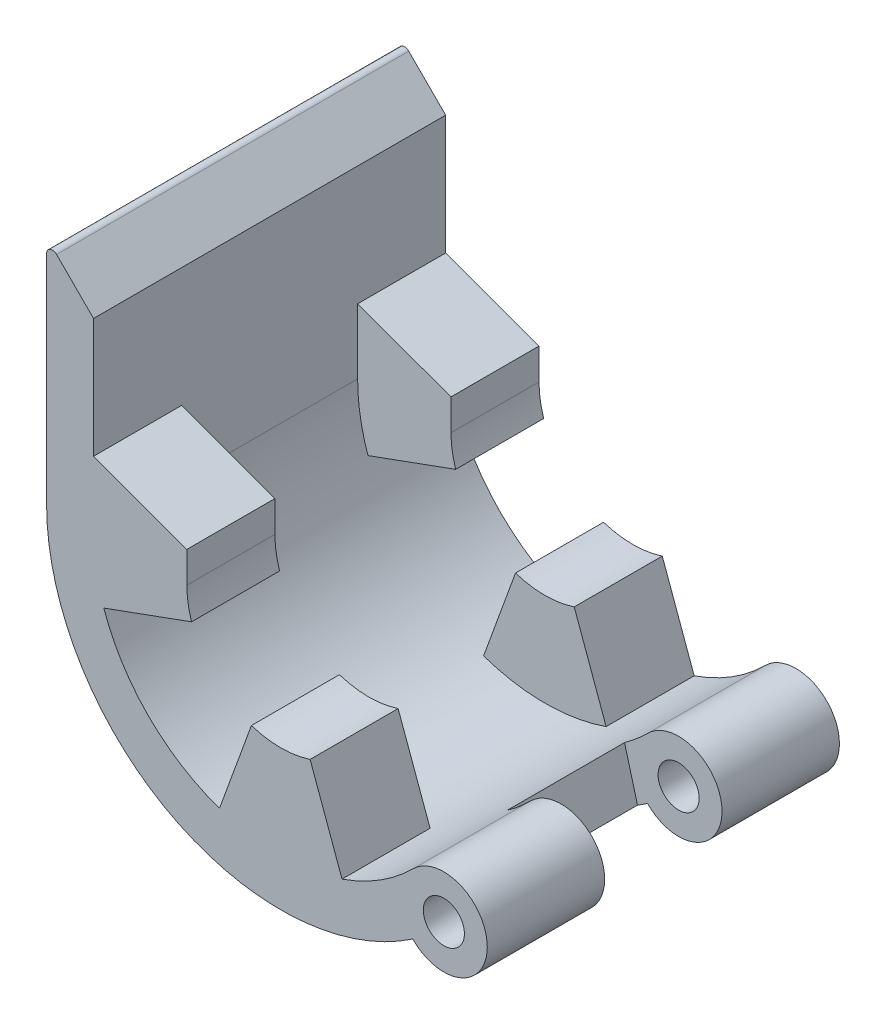
ISO-10303-21;
HEADER;
FILE_DESCRIPTION(('STEP AP214'),'2;1');
FILE_NAME('part.step','',(''),(''),'','','');
FILE_SCHEMA(('AUTOMOTIVE_DESIGN { 1 0 10303 214 1 1 1 1 }'));
ENDSEC;
DATA;
#1=APPLICATION_CONTEXT('core data for automotive mechanical design processes');
#2=APPLICATION_PROTOCOL_DEFINITION('international standard','automotive_design',2000,#1);
#3=PRODUCT_CONTEXT('',#1,'mechanical');
#4=PRODUCT('Part','Part','',(#3));
#5=PRODUCT_RELATED_PRODUCT_CATEGORY('part','',(#4));
#6=PRODUCT_DEFINITION_FORMATION('','',#4);
#7=PRODUCT_DEFINITION_CONTEXT('part definition',#1,'design');
#8=PRODUCT_DEFINITION('design','',#6,#7);
#9=PRODUCT_DEFINITION_SHAPE('','',#8);
#10=(LENGTH_UNIT() NAMED_UNIT(*) SI_UNIT(.MILLI.,.METRE.));
#11=(NAMED_UNIT(*) PLANE_ANGLE_UNIT() SI_UNIT($,.RADIAN.));
#12=(NAMED_UNIT(*) SI_UNIT($,.STERADIAN.) SOLID_ANGLE_UNIT());
#13=UNCERTAINTY_MEASURE_WITH_UNIT(LENGTH_MEASURE(1.E-05),#10,'distance_accuracy_value','');
#14=(GEOMETRIC_REPRESENTATION_CONTEXT(3) GLOBAL_UNCERTAINTY_ASSIGNED_CONTEXT((#13)) GLOBAL_UNIT_ASSIGNED_CONTEXT((#10,
#11,#12)) REPRESENTATION_CONTEXT('',''));
#15=CARTESIAN_POINT('',(0.,0.,0.));
#16=DIRECTION('',(0.,0.,1.));
#17=DIRECTION('',(1.,0.,0.));
#18=AXIS2_PLACEMENT_3D('',#15,#16,#17);
#19=CARTESIAN_POINT('',(0.,0.,15.));
#20=DIRECTION('',(0.,0.,-1.));
#21=DIRECTION('',(-1.,0.,0.));
#22=AXIS2_PLACEMENT_3D('',#19,#20,#21);
#23=CYLINDRICAL_SURFACE('',#22,15.95);
#24=DIRECTION('',(0.,0.,1.));
#25=VECTOR('',#24,1.);
#26=CARTESIAN_POINT('',(9.28940396087531,-12.9657037622982,-5.));
#27=LINE('',#26,#25);
#28=CARTESIAN_POINT('',(9.28940396087531,-12.9657037622982,-5.));
#29=VERTEX_POINT('',#28);
#30=CARTESIAN_POINT('',(9.28940396087531,-12.9657037622982,5.));
#31=VERTEX_POINT('',#30);
#32=EDGE_CURVE('E252',#29,#31,#27,.T.);
#33=ORIENTED_EDGE('',*,*,#32,.F.);
#34=CARTESIAN_POINT('',(0.,0.,-5.));
#35=DIRECTION('',(0.,0.,1.));
#36=DIRECTION('',(1.,0.,0.));
#37=AXIS2_PLACEMENT_3D('',#34,#35,#36);
#38=CIRCLE('',#37,15.95);
#39=CARTESIAN_POINT('',(11.2783531599254,-11.2783531599255,-5.));
#40=VERTEX_POINT('',#39);
#41=EDGE_CURVE('E235',#29,#40,#38,.T.);
#42=ORIENTED_EDGE('',*,*,#41,.T.);
#43=DIRECTION('',(0.,0.,-1.));
#44=VECTOR('',#43,1.);
#45=CARTESIAN_POINT('',(11.2783531599254,-11.2783531599255,15.));
#46=LINE('',#45,#44);
#47=CARTESIAN_POINT('',(11.2783531599254,-11.2783531599255,-15.));
#48=VERTEX_POINT('',#47);
#49=EDGE_CURVE('E475',#40,#48,#46,.T.);
#50=ORIENTED_EDGE('',*,*,#49,.T.);
#51=CARTESIAN_POINT('',(0.,0.,-15.));
#52=DIRECTION('',(0.,0.,1.));
#53=DIRECTION('',(1.,0.,0.));
#54=AXIS2_PLACEMENT_3D('',#51,#52,#53);
#55=CIRCLE('',#54,15.95);
#56=CARTESIAN_POINT('',(5.21972578697734,-15.0717272636139,-15.));
#57=VERTEX_POINT('',#56);
#58=EDGE_CURVE('E433',#57,#48,#55,.T.);
#59=ORIENTED_EDGE('',*,*,#58,.F.);
#60=DIRECTION('',(0.,0.,-1.));
#61=VECTOR('',#60,1.);
#62=CARTESIAN_POINT('',(5.21972578697734,-15.0717272636139,-7.5));
#63=LINE('',#62,#61);
#64=CARTESIAN_POINT('',(5.21972578697734,-15.0717272636139,-7.5));
#65=VERTEX_POINT('',#64);
#66=EDGE_CURVE('E299',#65,#57,#63,.T.);
#67=ORIENTED_EDGE('',*,*,#66,.F.);
#68=CARTESIAN_POINT('',(0.,0.,-7.5));
#69=DIRECTION('',(0.,0.,1.));
#70=DIRECTION('',(1.,0.,0.));
#71=AXIS2_PLACEMENT_3D('',#68,#69,#70);
#72=CIRCLE('',#71,15.95);
#73=CARTESIAN_POINT('',(-5.21972578697734,-15.0717272636139,-7.5));
#74=VERTEX_POINT('',#73);
#75=EDGE_CURVE('E278',#74,#65,#72,.T.);
#76=ORIENTED_EDGE('',*,*,#75,.F.);
#77=DIRECTION('',(0.,0.,-1.));
#78=VECTOR('',#77,1.);
#79=CARTESIAN_POINT('',(-5.21972578697734,-15.0717272636139,-7.5));
#80=LINE('',#79,#78);
#81=CARTESIAN_POINT('',(-5.21972578697734,-15.0717272636139,-15.));
#82=VERTEX_POINT('',#81);
#83=EDGE_CURVE('E295',#74,#82,#80,.T.);
#84=ORIENTED_EDGE('',*,*,#83,.T.);
#85=CARTESIAN_POINT('',(-15.071727263614,-5.21972578697729,-15.));
#86=VERTEX_POINT('',#85);
#87=EDGE_CURVE('E476',#86,#82,#55,.T.);
#88=ORIENTED_EDGE('',*,*,#87,.F.);
#89=DIRECTION('',(0.,0.,-1.));
#90=VECTOR('',#89,1.);
#91=CARTESIAN_POINT('',(-15.071727263614,-5.21972578697728,-7.5));
#92=LINE('',#91,#90);
#93=CARTESIAN_POINT('',(-15.071727263614,-5.21972578697728,-7.5));
#94=VERTEX_POINT('',#93);
#95=EDGE_CURVE('E349',#94,#86,#92,.T.);
#96=ORIENTED_EDGE('',*,*,#95,.F.);
#97=CARTESIAN_POINT('',(0.,0.,-7.5));
#98=DIRECTION('',(0.,0.,1.));
#99=DIRECTION('',(1.,0.,0.));
#100=AXIS2_PLACEMENT_3D('',#97,#98,#99);
#101=CIRCLE('',#100,15.95);
#102=CARTESIAN_POINT('',(-15.95,0.,-7.5));
#103=VERTEX_POINT('',#102);
#104=EDGE_CURVE('E313',#103,#94,#101,.T.);
#105=ORIENTED_EDGE('',*,*,#104,.F.);
#106=DIRECTION('',(0.,0.,-1.));
#107=VECTOR('',#106,1.);
#108=CARTESIAN_POINT('',(-15.95,0.,15.));
#109=LINE('',#108,#107);
#110=CARTESIAN_POINT('',(-15.95,0.,7.5));
#111=VERTEX_POINT('',#110);
#112=EDGE_CURVE('E11',#111,#103,#109,.T.);
#113=ORIENTED_EDGE('',*,*,#112,.F.);
#114=CARTESIAN_POINT('',(0.,0.,7.5));
#115=DIRECTION('',(0.,0.,1.));
#116=DIRECTION('',(1.,0.,0.));
#117=AXIS2_PLACEMENT_3D('',#114,#115,#116);
#118=CIRCLE('',#117,15.95);
#119=CARTESIAN_POINT('',(-15.071727263614,-5.21972578697729,7.5));
#120=VERTEX_POINT('',#119);
#121=EDGE_CURVE('E414',#111,#120,#118,.T.);
#122=ORIENTED_EDGE('',*,*,#121,.T.);
#123=DIRECTION('',(0.,0.,1.));
#124=VECTOR('',#123,1.);
#125=CARTESIAN_POINT('',(-15.071727263614,-5.21972578697728,7.5));
#126=LINE('',#125,#124);
#127=CARTESIAN_POINT('',(-15.071727263614,-5.21972578697728,15.));
#128=VERTEX_POINT('',#127);
#129=EDGE_CURVE('E430',#120,#128,#126,.T.);
#130=ORIENTED_EDGE('',*,*,#129,.T.);
#131=CARTESIAN_POINT('',(0.,0.,15.));
#132=DIRECTION('',(0.,0.,1.));
#133=DIRECTION('',(1.,0.,0.));
#134=AXIS2_PLACEMENT_3D('',#131,#132,#133);
#135=CIRCLE('',#134,15.95);
#136=CARTESIAN_POINT('',(-5.21972578697734,-15.0717272636139,15.));
#137=VERTEX_POINT('',#136);
#138=EDGE_CURVE('E448',#128,#137,#135,.T.);
#139=ORIENTED_EDGE('',*,*,#138,.T.);
#140=DIRECTION('',(0.,0.,1.));
#141=VECTOR('',#140,1.);
#142=CARTESIAN_POINT('',(-5.21972578697734,-15.0717272636139,7.5));
#143=LINE('',#142,#141);
#144=CARTESIAN_POINT('',(-5.21972578697734,-15.0717272636139,7.5));
#145=VERTEX_POINT('',#144);
#146=EDGE_CURVE('E383',#145,#137,#143,.T.);
#147=ORIENTED_EDGE('',*,*,#146,.F.);
#148=CARTESIAN_POINT('',(0.,0.,7.5));
#149=DIRECTION('',(0.,0.,1.));
#150=DIRECTION('',(1.,0.,0.));
#151=AXIS2_PLACEMENT_3D('',#148,#149,#150);
#152=CIRCLE('',#151,15.95);
#153=CARTESIAN_POINT('',(5.21972578697734,-15.0717272636139,7.5));
#154=VERTEX_POINT('',#153);
#155=EDGE_CURVE('E364',#145,#154,#152,.T.);
#156=ORIENTED_EDGE('',*,*,#155,.T.);
#157=DIRECTION('',(0.,0.,1.));
#158=VECTOR('',#157,1.);
#159=CARTESIAN_POINT('',(5.21972578697734,-15.0717272636139,7.5));
#160=LINE('',#159,#158);
#161=CARTESIAN_POINT('',(5.21972578697734,-15.0717272636139,15.));
#162=VERTEX_POINT('',#161);
#163=EDGE_CURVE('E387',#154,#162,#160,.T.);
#164=ORIENTED_EDGE('',*,*,#163,.T.);
#165=CARTESIAN_POINT('',(11.2783531599254,-11.2783531599255,15.));
#166=VERTEX_POINT('',#165);
#167=EDGE_CURVE('E452',#162,#166,#135,.T.);
#168=ORIENTED_EDGE('',*,*,#167,.T.);
#169=CARTESIAN_POINT('',(11.2783531599254,-11.2783531599255,5.));
#170=VERTEX_POINT('',#169);
#171=EDGE_CURVE('E505',#166,#170,#46,.T.);
#172=ORIENTED_EDGE('',*,*,#171,.T.);
#173=CARTESIAN_POINT('',(0.,0.,5.));
#174=DIRECTION('',(0.,0.,1.));
#175=DIRECTION('',(1.,0.,0.));
#176=AXIS2_PLACEMENT_3D('',#173,#174,#175);
#177=CIRCLE('',#176,15.95);
#178=EDGE_CURVE('E56',#31,#170,#177,.T.);
#179=ORIENTED_EDGE('',*,*,#178,.F.);
#180=EDGE_LOOP('',(#33,#42,#50,#59,#67,#76,#84,#88,#96,#105,#113,#122,#130,#139,#147,#156,#164,
#168,#172,#179));
#181=FACE_BOUND('',#180,.T.);
#182=ADVANCED_FACE('F41',(#181),#23,.F.);
#183=CARTESIAN_POINT('',(0.,0.,15.));
#184=DIRECTION('',(0.,0.,-1.));
#185=DIRECTION('',(-1.,0.,0.));
#186=AXIS2_PLACEMENT_3D('',#183,#184,#185);
#187=CYLINDRICAL_SURFACE('',#186,19.95);
#188=CARTESIAN_POINT('',(0.,0.,-5.));
#189=DIRECTION('',(0.,0.,1.));
#190=DIRECTION('',(1.,0.,0.));
#191=AXIS2_PLACEMENT_3D('',#188,#189,#190);
#192=CIRCLE('',#191,19.95);
#193=CARTESIAN_POINT('',(10.3943586708893,-17.0282062420242,-5.));
#194=VERTEX_POINT('',#193);
#195=CARTESIAN_POINT('',(11.2459893589939,-16.4781741505967,-5.));
#196=VERTEX_POINT('',#195);
#197=EDGE_CURVE('E256',#194,#196,#192,.T.);
#198=ORIENTED_EDGE('',*,*,#197,.F.);
#199=DIRECTION('',(0.,0.,1.));
#200=VECTOR('',#199,1.);
#201=CARTESIAN_POINT('',(10.3943586708893,-17.0282062420242,-5.));
#202=LINE('',#201,#200);
#203=CARTESIAN_POINT('',(10.3943586708893,-17.0282062420242,5.));
#204=VERTEX_POINT('',#203);
#205=EDGE_CURVE('E254',#194,#204,#202,.T.);
#206=ORIENTED_EDGE('',*,*,#205,.T.);
#207=CARTESIAN_POINT('',(0.,0.,5.));
#208=DIRECTION('',(0.,0.,1.));
#209=DIRECTION('',(1.,0.,0.));
#210=AXIS2_PLACEMENT_3D('',#207,#208,#209);
#211=CIRCLE('',#210,19.95);
#212=CARTESIAN_POINT('',(11.2459893589939,-16.4781741505967,5.));
#213=VERTEX_POINT('',#212);
#214=EDGE_CURVE('E671',#204,#213,#211,.T.);
#215=ORIENTED_EDGE('',*,*,#214,.T.);
#216=DIRECTION('',(0.,0.,-1.));
#217=VECTOR('',#216,1.);
#218=CARTESIAN_POINT('',(11.2459893589939,-16.4781741505967,15.));
#219=LINE('',#218,#217);
#220=CARTESIAN_POINT('',(11.2459893589939,-16.4781741505967,15.));
#221=VERTEX_POINT('',#220);
#222=EDGE_CURVE('E509',#221,#213,#219,.T.);
#223=ORIENTED_EDGE('',*,*,#222,.F.);
#224=CARTESIAN_POINT('',(0.,0.,15.));
#225=DIRECTION('',(0.,0.,1.));
#226=DIRECTION('',(1.,0.,0.));
#227=AXIS2_PLACEMENT_3D('',#224,#225,#226);
#228=CIRCLE('',#227,19.95);
#229=CARTESIAN_POINT('',(-19.95,0.,15.));
#230=VERTEX_POINT('',#229);
#231=EDGE_CURVE('E464',#230,#221,#228,.T.);
#232=ORIENTED_EDGE('',*,*,#231,.F.);
#233=DIRECTION('',(0.,0.,-1.));
#234=VECTOR('',#233,1.);
#235=CARTESIAN_POINT('',(-19.95,0.,15.));
#236=LINE('',#235,#234);
#237=CARTESIAN_POINT('',(-19.95,0.,-15.));
#238=VERTEX_POINT('',#237);
#239=EDGE_CURVE('E513',#230,#238,#236,.T.);
#240=ORIENTED_EDGE('',*,*,#239,.T.);
#241=CARTESIAN_POINT('',(0.,0.,-15.));
#242=DIRECTION('',(0.,0.,1.));
#243=DIRECTION('',(1.,0.,0.));
#244=AXIS2_PLACEMENT_3D('',#241,#242,#243);
#245=CIRCLE('',#244,19.95);
#246=CARTESIAN_POINT('',(11.2459893589939,-16.4781741505967,-15.));
#247=VERTEX_POINT('',#246);
#248=EDGE_CURVE('E493',#238,#247,#245,.T.);
#249=ORIENTED_EDGE('',*,*,#248,.T.);
#250=EDGE_CURVE('E508',#196,#247,#219,.T.);
#251=ORIENTED_EDGE('',*,*,#250,.F.);
#252=EDGE_LOOP('',(#198,#206,#215,#223,#232,#240,#249,#251));
#253=FACE_BOUND('',#252,.T.);
#254=ADVANCED_FACE('F585',(#253),#187,.T.);
#255=CARTESIAN_POINT('',(13.8946482503156,-13.8946482503157,15.));
#256=DIRECTION('',(0.,0.,-1.));
#257=DIRECTION('',(-1.,0.,0.));
#258=AXIS2_PLACEMENT_3D('',#255,#256,#257);
#259=CYLINDRICAL_SURFACE('',#258,3.7);
#260=CARTESIAN_POINT('',(13.8946482503156,-13.8946482503157,-5.));
#261=DIRECTION('',(0.,0.,1.));
#262=DIRECTION('',(1.,0.,0.));
#263=AXIS2_PLACEMENT_3D('',#260,#261,#262);
#264=CIRCLE('',#263,3.7);
#265=EDGE_CURVE('E242',#196,#40,#264,.T.);
#266=ORIENTED_EDGE('',*,*,#265,.F.);
#267=ORIENTED_EDGE('',*,*,#250,.T.);
#268=CARTESIAN_POINT('',(13.8946482503156,-13.8946482503157,-15.));
#269=DIRECTION('',(0.,0.,1.));
#270=DIRECTION('',(1.,0.,0.));
#271=AXIS2_PLACEMENT_3D('',#268,#269,#270);
#272=CIRCLE('',#271,3.7);
#273=EDGE_CURVE('E497',#247,#48,#272,.T.);
#274=ORIENTED_EDGE('',*,*,#273,.T.);
#275=ORIENTED_EDGE('',*,*,#49,.F.);
#276=EDGE_LOOP('',(#266,#267,#274,#275));
#277=FACE_BOUND('',#276,.T.);
#278=ADVANCED_FACE('F582',(#277),#259,.T.);
#279=CARTESIAN_POINT('',(13.8946482503156,-13.8946482503157,15.));
#280=DIRECTION('',(0.,0.,-1.));
#281=DIRECTION('',(-1.,0.,0.));
#282=AXIS2_PLACEMENT_3D('',#279,#280,#281);
#283=CYLINDRICAL_SURFACE('',#282,1.75);
#284=CARTESIAN_POINT('',(13.8946482503156,-13.8946482503157,-15.));
#285=DIRECTION('',(0.,0.,1.));
#286=DIRECTION('',(1.,0.,0.));
#287=AXIS2_PLACEMENT_3D('',#284,#285,#286);
#288=CIRCLE('',#287,1.75);
#289=CARTESIAN_POINT('',(15.6446482503156,-13.8946482503157,-15.));
#290=VERTEX_POINT('',#289);
#291=EDGE_CURVE('E501',#290,#290,#288,.T.);
#292=ORIENTED_EDGE('',*,*,#291,.F.);
#293=EDGE_LOOP('',(#292));
#294=FACE_BOUND('',#293,.T.);
#295=CARTESIAN_POINT('',(13.8946482503156,-13.8946482503157,-5.));
#296=DIRECTION('',(0.,0.,1.));
#297=DIRECTION('',(1.,0.,0.));
#298=AXIS2_PLACEMENT_3D('',#295,#296,#297);
#299=CIRCLE('',#298,1.75);
#300=CARTESIAN_POINT('',(15.6446482503156,-13.8946482503157,-5.));
#301=VERTEX_POINT('',#300);
#302=EDGE_CURVE('E260',#301,#301,#299,.T.);
#303=ORIENTED_EDGE('',*,*,#302,.T.);
#304=EDGE_LOOP('',(#303));
#305=FACE_BOUND('',#304,.T.);
#306=ADVANCED_FACE('F634',(#294,#305),#283,.F.);
#307=CARTESIAN_POINT('',(-15.95,0.,15.));
#308=DIRECTION('',(1.,0.,0.));
#309=DIRECTION('',(0.,0.,-1.));
#310=AXIS2_PLACEMENT_3D('',#307,#308,#309);
#311=PLANE('',#310);
#312=DIRECTION('',(0.,-1.,0.));
#313=VECTOR('',#312,1.);
#314=CARTESIAN_POINT('',(-15.95,0.,-7.5));
#315=LINE('',#314,#313);
#316=CARTESIAN_POINT('',(-15.95,5.53939092058933,-7.5));
#317=VERTEX_POINT('',#316);
#318=EDGE_CURVE('E316',#317,#103,#315,.T.);
#319=ORIENTED_EDGE('',*,*,#318,.F.);
#320=DIRECTION('',(0.,0.,-1.));
#321=VECTOR('',#320,1.);
#322=CARTESIAN_POINT('',(-15.95,5.53939092058933,-7.5));
#323=LINE('',#322,#321);
#324=CARTESIAN_POINT('',(-15.95,5.53939092058933,-15.));
#325=VERTEX_POINT('',#324);
#326=EDGE_CURVE('E345',#317,#325,#323,.T.);
#327=ORIENTED_EDGE('',*,*,#326,.T.);
#328=DIRECTION('',(0.,-1.,0.));
#329=VECTOR('',#328,1.);
#330=CARTESIAN_POINT('',(-15.95,0.,-15.));
#331=LINE('',#330,#329);
#332=CARTESIAN_POINT('',(-15.95,15.7071067811865,-15.));
#333=VERTEX_POINT('',#332);
#334=EDGE_CURVE('E480',#333,#325,#331,.T.);
#335=ORIENTED_EDGE('',*,*,#334,.F.);
#336=DIRECTION('',(0.,0.,-1.));
#337=VECTOR('',#336,1.);
#338=CARTESIAN_POINT('',(-15.95,15.7071067811865,15.));
#339=LINE('',#338,#337);
#340=CARTESIAN_POINT('',(-15.95,15.7071067811865,15.));
#341=VERTEX_POINT('',#340);
#342=EDGE_CURVE('E49',#341,#333,#339,.T.);
#343=ORIENTED_EDGE('',*,*,#342,.F.);
#344=DIRECTION('',(0.,-1.,0.));
#345=VECTOR('',#344,1.);
#346=CARTESIAN_POINT('',(-15.95,0.,15.));
#347=LINE('',#346,#345);
#348=CARTESIAN_POINT('',(-15.95,5.53939092058933,15.));
#349=VERTEX_POINT('',#348);
#350=EDGE_CURVE('E451',#341,#349,#347,.T.);
#351=ORIENTED_EDGE('',*,*,#350,.T.);
#352=DIRECTION('',(0.,0.,1.));
#353=VECTOR('',#352,1.);
#354=CARTESIAN_POINT('',(-15.95,5.53939092058933,7.5));
#355=LINE('',#354,#353);
#356=CARTESIAN_POINT('',(-15.95,5.53939092058933,7.5));
#357=VERTEX_POINT('',#356);
#358=EDGE_CURVE('E434',#357,#349,#355,.T.);
#359=ORIENTED_EDGE('',*,*,#358,.F.);
#360=DIRECTION('',(0.,1.,0.));
#361=VECTOR('',#360,1.);
#362=CARTESIAN_POINT('',(-15.95,0.,7.5));
#363=LINE('',#362,#361);
#364=EDGE_CURVE('E410',#111,#357,#363,.T.);
#365=ORIENTED_EDGE('',*,*,#364,.F.);
#366=ORIENTED_EDGE('',*,*,#112,.T.);
#367=EDGE_LOOP('',(#319,#327,#335,#343,#351,#359,#365,#366));
#368=FACE_BOUND('',#367,.T.);
#369=ADVANCED_FACE('F539',(#368),#311,.T.);
#370=CARTESIAN_POINT('',(-0.12144660940682,-0.121446609406819,15.));
#371=DIRECTION('',(-0.707106781186551,-0.707106781186544,0.));
#372=DIRECTION('',(0.707106781186544,-0.707106781186551,0.));
#373=AXIS2_PLACEMENT_3D('',#370,#371,#372);
#374=PLANE('',#373);
#375=DIRECTION('',(-0.707106781186544,0.707106781186551,0.));
#376=VECTOR('',#375,1.);
#377=CARTESIAN_POINT('',(-0.12144660940682,-0.121446609406819,-15.));
#378=LINE('',#377,#376);
#379=CARTESIAN_POINT('',(-19.0964466094067,18.8535533905933,-15.));
#380=VERTEX_POINT('',#379);
#381=EDGE_CURVE('E484',#333,#380,#378,.T.);
#382=ORIENTED_EDGE('',*,*,#381,.T.);
#383=DIRECTION('',(0.,0.,-1.));
#384=VECTOR('',#383,1.);
#385=CARTESIAN_POINT('',(-19.0964466094067,18.8535533905933,15.));
#386=LINE('',#385,#384);
#387=CARTESIAN_POINT('',(-19.0964466094067,18.8535533905933,15.));
#388=VERTEX_POINT('',#387);
#389=EDGE_CURVE('E521',#388,#380,#386,.T.);
#390=ORIENTED_EDGE('',*,*,#389,.F.);
#391=DIRECTION('',(-0.707106781186544,0.707106781186551,0.));
#392=VECTOR('',#391,1.);
#393=CARTESIAN_POINT('',(-0.12144660940682,-0.121446609406819,15.));
#394=LINE('',#393,#392);
#395=EDGE_CURVE('E455',#341,#388,#394,.T.);
#396=ORIENTED_EDGE('',*,*,#395,.F.);
#397=ORIENTED_EDGE('',*,*,#342,.T.);
#398=EDGE_LOOP('',(#382,#390,#396,#397));
#399=FACE_BOUND('',#398,.T.);
#400=ADVANCED_FACE('F528',(#399),#374,.F.);
#401=CARTESIAN_POINT('',(-19.4500000000001,18.5,15.));
#402=DIRECTION('',(0.,0.,-1.));
#403=DIRECTION('',(-1.,0.,0.));
#404=AXIS2_PLACEMENT_3D('',#401,#402,#403);
#405=CYLINDRICAL_SURFACE('',#404,0.500000000000045);
#406=CARTESIAN_POINT('',(-19.4500000000001,18.5,-15.));
#407=DIRECTION('',(0.,0.,1.));
#408=DIRECTION('',(1.,0.,0.));
#409=AXIS2_PLACEMENT_3D('',#406,#407,#408);
#410=CIRCLE('',#409,0.500000000000045);
#411=CARTESIAN_POINT('',(-19.9500000000001,18.5,-15.));
#412=VERTEX_POINT('',#411);
#413=EDGE_CURVE('E487',#380,#412,#410,.T.);
#414=ORIENTED_EDGE('',*,*,#413,.T.);
#415=DIRECTION('',(0.,0.,-1.));
#416=VECTOR('',#415,1.);
#417=CARTESIAN_POINT('',(-19.9500000000001,18.5,15.));
#418=LINE('',#417,#416);
#419=CARTESIAN_POINT('',(-19.9500000000001,18.5,15.));
#420=VERTEX_POINT('',#419);
#421=EDGE_CURVE('E517',#420,#412,#418,.T.);
#422=ORIENTED_EDGE('',*,*,#421,.F.);
#423=CARTESIAN_POINT('',(-19.4500000000001,18.5,15.));
#424=DIRECTION('',(0.,0.,1.));
#425=DIRECTION('',(1.,0.,0.));
#426=AXIS2_PLACEMENT_3D('',#423,#424,#425);
#427=CIRCLE('',#426,0.500000000000045);
#428=EDGE_CURVE('E458',#388,#420,#427,.T.);
#429=ORIENTED_EDGE('',*,*,#428,.F.);
#430=ORIENTED_EDGE('',*,*,#389,.T.);
#431=EDGE_LOOP('',(#414,#422,#429,#430));
#432=FACE_BOUND('',#431,.T.);
#433=ADVANCED_FACE('F594',(#432),#405,.T.);
#434=CARTESIAN_POINT('',(-19.95,-1.38430933382949E-13,15.));
#435=DIRECTION('',(1.,0.,0.));
#436=DIRECTION('',(0.,1.,0.));
#437=AXIS2_PLACEMENT_3D('',#434,#435,#436);
#438=PLANE('',#437);
#439=DIRECTION('',(0.,-1.,0.));
#440=VECTOR('',#439,1.);
#441=CARTESIAN_POINT('',(-19.95,-1.38430933382949E-13,-15.));
#442=LINE('',#441,#440);
#443=EDGE_CURVE('E490',#412,#238,#442,.T.);
#444=ORIENTED_EDGE('',*,*,#443,.T.);
#445=ORIENTED_EDGE('',*,*,#239,.F.);
#446=DIRECTION('',(0.,-1.,0.));
#447=VECTOR('',#446,1.);
#448=CARTESIAN_POINT('',(-19.95,-1.38430933382949E-13,15.));
#449=LINE('',#448,#447);
#450=EDGE_CURVE('E461',#420,#230,#449,.T.);
#451=ORIENTED_EDGE('',*,*,#450,.F.);
#452=ORIENTED_EDGE('',*,*,#421,.T.);
#453=EDGE_LOOP('',(#444,#445,#451,#452));
#454=FACE_BOUND('',#453,.T.);
#455=ADVANCED_FACE('F589',(#454),#438,.F.);
#456=ORIENTED_EDGE('',*,*,#222,.T.);
#457=CARTESIAN_POINT('',(13.8946482503156,-13.8946482503157,5.));
#458=DIRECTION('',(0.,0.,1.));
#459=DIRECTION('',(1.,0.,0.));
#460=AXIS2_PLACEMENT_3D('',#457,#458,#459);
#461=CIRCLE('',#460,3.7);
#462=EDGE_CURVE('E669',#213,#170,#461,.T.);
#463=ORIENTED_EDGE('',*,*,#462,.T.);
#464=ORIENTED_EDGE('',*,*,#171,.F.);
#465=CARTESIAN_POINT('',(13.8946482503156,-13.8946482503157,15.));
#466=DIRECTION('',(0.,0.,1.));
#467=DIRECTION('',(1.,0.,0.));
#468=AXIS2_PLACEMENT_3D('',#465,#466,#467);
#469=CIRCLE('',#468,3.7);
#470=EDGE_CURVE('E467',#221,#166,#469,.T.);
#471=ORIENTED_EDGE('',*,*,#470,.F.);
#472=EDGE_LOOP('',(#456,#463,#464,#471));
#473=FACE_BOUND('',#472,.T.);
#474=ADVANCED_FACE('F636',(#473),#259,.T.);
#475=CARTESIAN_POINT('',(13.8946482503156,-13.8946482503157,5.));
#476=DIRECTION('',(0.,0.,1.));
#477=DIRECTION('',(1.,0.,0.));
#478=AXIS2_PLACEMENT_3D('',#475,#476,#477);
#479=CIRCLE('',#478,1.75);
#480=CARTESIAN_POINT('',(15.6446482503156,-13.8946482503157,5.));
#481=VERTEX_POINT('',#480);
#482=EDGE_CURVE('E247',#481,#481,#479,.T.);
#483=ORIENTED_EDGE('',*,*,#482,.F.);
#484=EDGE_LOOP('',(#483));
#485=FACE_BOUND('',#484,.T.);
#486=CARTESIAN_POINT('',(13.8946482503156,-13.8946482503157,15.));
#487=DIRECTION('',(0.,0.,1.));
#488=DIRECTION('',(1.,0.,0.));
#489=AXIS2_PLACEMENT_3D('',#486,#487,#488);
#490=CIRCLE('',#489,1.75);
#491=CARTESIAN_POINT('',(15.6446482503156,-13.8946482503157,15.));
#492=VERTEX_POINT('',#491);
#493=EDGE_CURVE('E471',#492,#492,#490,.T.);
#494=ORIENTED_EDGE('',*,*,#493,.T.);
#495=EDGE_LOOP('',(#494));
#496=FACE_BOUND('',#495,.T.);
#497=ADVANCED_FACE('F649',(#485,#496),#283,.F.);
#498=CARTESIAN_POINT('',(0.,0.,15.));
#499=DIRECTION('',(0.,0.,1.));
#500=DIRECTION('',(1.,0.,0.));
#501=AXIS2_PLACEMENT_3D('',#498,#499,#500);
#502=PLANE('',#501);
#503=ORIENTED_EDGE('',*,*,#138,.F.);
#504=DIRECTION('',(0.93969262078591,0.342020143325665,0.));
#505=VECTOR('',#504,1.);
#506=CARTESIAN_POINT('',(-0.0854696416436594,0.234825910464835,15.));
#507=LINE('',#506,#505);
#508=CARTESIAN_POINT('',(-7.59934207678531,-2.5,15.));
#509=VERTEX_POINT('',#508);
#510=EDGE_CURVE('E395',#128,#509,#507,.T.);
#511=ORIENTED_EDGE('',*,*,#510,.T.);
#512=CARTESIAN_POINT('',(0.,0.,15.));
#513=DIRECTION('',(0.,0.,1.));
#514=DIRECTION('',(1.,0.,0.));
#515=AXIS2_PLACEMENT_3D('',#512,#513,#514);
#516=CIRCLE('',#515,7.99999999999998);
#517=CARTESIAN_POINT('',(-7.99999999999998,0.,15.));
#518=VERTEX_POINT('',#517);
#519=EDGE_CURVE('E421',#518,#509,#516,.T.);
#520=ORIENTED_EDGE('',*,*,#519,.F.);
#521=DIRECTION('',(0.,-1.,0.));
#522=VECTOR('',#521,1.);
#523=CARTESIAN_POINT('',(-7.99999999999998,0.,15.));
#524=LINE('',#523,#522);
#525=CARTESIAN_POINT('',(-7.99999999999998,2.64582755817305,15.));
#526=VERTEX_POINT('',#525);
#527=EDGE_CURVE('E425',#526,#518,#524,.T.);
#528=ORIENTED_EDGE('',*,*,#527,.F.);
#529=DIRECTION('',(0.93969262078591,-0.342020143325665,0.));
#530=VECTOR('',#529,1.);
#531=CARTESIAN_POINT('',(-0.0854696416436583,-0.234825910464833,15.));
#532=LINE('',#531,#530);
#533=EDGE_CURVE('E401',#349,#526,#532,.T.);
#534=ORIENTED_EDGE('',*,*,#533,.F.);
#535=ORIENTED_EDGE('',*,*,#350,.F.);
#536=ORIENTED_EDGE('',*,*,#395,.T.);
#537=ORIENTED_EDGE('',*,*,#428,.T.);
#538=ORIENTED_EDGE('',*,*,#450,.T.);
#539=ORIENTED_EDGE('',*,*,#231,.T.);
#540=ORIENTED_EDGE('',*,*,#470,.T.);
#541=ORIENTED_EDGE('',*,*,#167,.F.);
#542=DIRECTION('',(0.342020143325666,-0.93969262078591,0.));
#543=VECTOR('',#542,1.);
#544=CARTESIAN_POINT('',(-0.23482591046479,-0.0854696416436429,15.));
#545=LINE('',#544,#543);
#546=CARTESIAN_POINT('',(2.50000000000005,-7.5993420767853,15.));
#547=VERTEX_POINT('',#546);
#548=EDGE_CURVE('E374',#547,#162,#545,.T.);
#549=ORIENTED_EDGE('',*,*,#548,.F.);
#550=CARTESIAN_POINT('',(0.,0.,15.));
#551=DIRECTION('',(0.,0.,1.));
#552=DIRECTION('',(1.,0.,0.));
#553=AXIS2_PLACEMENT_3D('',#550,#551,#552);
#554=CIRCLE('',#553,7.99999999999998);
#555=CARTESIAN_POINT('',(-2.50000000000005,-7.5993420767853,15.));
#556=VERTEX_POINT('',#555);
#557=EDGE_CURVE('E340',#556,#547,#554,.T.);
#558=ORIENTED_EDGE('',*,*,#557,.F.);
#559=DIRECTION('',(0.342020143325666,0.93969262078591,0.));
#560=VECTOR('',#559,1.);
#561=CARTESIAN_POINT('',(0.23482591046479,-0.085469641643643,15.));
#562=LINE('',#561,#560);
#563=EDGE_CURVE('E360',#137,#556,#562,.T.);
#564=ORIENTED_EDGE('',*,*,#563,.F.);
#565=EDGE_LOOP('',(#503,#511,#520,#528,#534,#535,#536,#537,#538,#539,#540,#541,#549,#558,#564));
#566=FACE_BOUND('',#565,.T.);
#567=ORIENTED_EDGE('',*,*,#493,.F.);
#568=EDGE_LOOP('',(#567));
#569=FACE_BOUND('',#568,.T.);
#570=ADVANCED_FACE('F597',(#566,#569),#502,.T.);
#571=CARTESIAN_POINT('',(0.,0.,-15.));
#572=DIRECTION('',(0.,0.,1.));
#573=DIRECTION('',(1.,0.,0.));
#574=AXIS2_PLACEMENT_3D('',#571,#572,#573);
#575=PLANE('',#574);
#576=ORIENTED_EDGE('',*,*,#334,.T.);
#577=DIRECTION('',(-0.93969262078591,0.342020143325665,0.));
#578=VECTOR('',#577,1.);
#579=CARTESIAN_POINT('',(-0.0854696416436583,-0.234825910464833,-15.));
#580=LINE('',#579,#578);
#581=CARTESIAN_POINT('',(-7.99999999999998,2.64582755817305,-15.));
#582=VERTEX_POINT('',#581);
#583=EDGE_CURVE('E332',#582,#325,#580,.T.);
#584=ORIENTED_EDGE('',*,*,#583,.F.);
#585=DIRECTION('',(0.,1.,0.));
#586=VECTOR('',#585,1.);
#587=CARTESIAN_POINT('',(-7.99999999999998,0.,-15.));
#588=LINE('',#587,#586);
#589=CARTESIAN_POINT('',(-7.99999999999998,0.,-15.));
#590=VERTEX_POINT('',#589);
#591=EDGE_CURVE('E309',#590,#582,#588,.T.);
#592=ORIENTED_EDGE('',*,*,#591,.F.);
#593=CARTESIAN_POINT('',(0.,0.,-15.));
#594=DIRECTION('',(0.,0.,1.));
#595=DIRECTION('',(1.,0.,0.));
#596=AXIS2_PLACEMENT_3D('',#593,#594,#595);
#597=CIRCLE('',#596,7.99999999999998);
#598=CARTESIAN_POINT('',(-7.59934207678532,-2.5,-15.));
#599=VERTEX_POINT('',#598);
#600=EDGE_CURVE('E294',#590,#599,#597,.T.);
#601=ORIENTED_EDGE('',*,*,#600,.T.);
#602=DIRECTION('',(-0.93969262078591,-0.342020143325665,0.));
#603=VECTOR('',#602,1.);
#604=CARTESIAN_POINT('',(-0.0854696416436594,0.234825910464835,-15.));
#605=LINE('',#604,#603);
#606=EDGE_CURVE('E329',#599,#86,#605,.T.);
#607=ORIENTED_EDGE('',*,*,#606,.T.);
#608=ORIENTED_EDGE('',*,*,#87,.T.);
#609=DIRECTION('',(-0.342020143325666,-0.93969262078591,0.));
#610=VECTOR('',#609,1.);
#611=CARTESIAN_POINT('',(0.23482591046479,-0.085469641643643,-15.));
#612=LINE('',#611,#610);
#613=CARTESIAN_POINT('',(-2.50000000000005,-7.5993420767853,-15.));
#614=VERTEX_POINT('',#613);
#615=EDGE_CURVE('E275',#614,#82,#612,.T.);
#616=ORIENTED_EDGE('',*,*,#615,.F.);
#617=CARTESIAN_POINT('',(0.,0.,-15.));
#618=DIRECTION('',(0.,0.,1.));
#619=DIRECTION('',(1.,0.,0.));
#620=AXIS2_PLACEMENT_3D('',#617,#618,#619);
#621=CIRCLE('',#620,7.99999999999998);
#622=CARTESIAN_POINT('',(2.50000000000005,-7.5993420767853,-15.));
#623=VERTEX_POINT('',#622);
#624=EDGE_CURVE('E264',#614,#623,#621,.T.);
#625=ORIENTED_EDGE('',*,*,#624,.T.);
#626=DIRECTION('',(-0.342020143325666,0.93969262078591,0.));
#627=VECTOR('',#626,1.);
#628=CARTESIAN_POINT('',(-0.23482591046479,-0.0854696416436429,-15.));
#629=LINE('',#628,#627);
#630=EDGE_CURVE('E64',#57,#623,#629,.T.);
#631=ORIENTED_EDGE('',*,*,#630,.F.);
#632=ORIENTED_EDGE('',*,*,#58,.T.);
#633=ORIENTED_EDGE('',*,*,#273,.F.);
#634=ORIENTED_EDGE('',*,*,#248,.F.);
#635=ORIENTED_EDGE('',*,*,#443,.F.);
#636=ORIENTED_EDGE('',*,*,#413,.F.);
#637=ORIENTED_EDGE('',*,*,#381,.F.);
#638=EDGE_LOOP('',(#576,#584,#592,#601,#607,#608,#616,#625,#631,#632,#633,#634,#635,#636,#637));
#639=FACE_BOUND('',#638,.T.);
#640=ORIENTED_EDGE('',*,*,#291,.T.);
#641=EDGE_LOOP('',(#640));
#642=FACE_BOUND('',#641,.T.);
#643=ADVANCED_FACE('F534',(#639,#642),#575,.F.);
#644=CARTESIAN_POINT('',(-0.0854696416436594,0.234825910464835,7.5));
#645=DIRECTION('',(0.342020143325665,-0.93969262078591,0.));
#646=DIRECTION('',(0.93969262078591,0.342020143325665,0.));
#647=AXIS2_PLACEMENT_3D('',#644,#645,#646);
#648=PLANE('',#647);
#649=ORIENTED_EDGE('',*,*,#510,.F.);
#650=ORIENTED_EDGE('',*,*,#129,.F.);
#651=DIRECTION('',(0.93969262078591,0.342020143325665,0.));
#652=VECTOR('',#651,1.);
#653=CARTESIAN_POINT('',(-0.0854696416436594,0.234825910464835,7.5));
#654=LINE('',#653,#652);
#655=CARTESIAN_POINT('',(-7.59934207678531,-2.5,7.5));
#656=VERTEX_POINT('',#655);
#657=EDGE_CURVE('E396',#120,#656,#654,.T.);
#658=ORIENTED_EDGE('',*,*,#657,.T.);
#659=DIRECTION('',(0.,0.,1.));
#660=VECTOR('',#659,1.);
#661=CARTESIAN_POINT('',(-7.59934207678531,-2.5,7.5));
#662=LINE('',#661,#660);
#663=EDGE_CURVE('E417',#656,#509,#662,.T.);
#664=ORIENTED_EDGE('',*,*,#663,.T.);
#665=EDGE_LOOP('',(#649,#650,#658,#664));
#666=FACE_BOUND('',#665,.T.);
#667=ADVANCED_FACE('F704',(#666),#648,.T.);
#668=CARTESIAN_POINT('',(-0.0854696416436583,-0.234825910464833,7.5));
#669=DIRECTION('',(-0.342020143325665,-0.93969262078591,0.));
#670=DIRECTION('',(0.93969262078591,-0.342020143325665,0.));
#671=AXIS2_PLACEMENT_3D('',#668,#669,#670);
#672=PLANE('',#671);
#673=ORIENTED_EDGE('',*,*,#533,.T.);
#674=DIRECTION('',(0.,0.,1.));
#675=VECTOR('',#674,1.);
#676=CARTESIAN_POINT('',(-7.99999999999998,2.64582755817305,7.5));
#677=LINE('',#676,#675);
#678=CARTESIAN_POINT('',(-7.99999999999998,2.64582755817305,7.5));
#679=VERTEX_POINT('',#678);
#680=EDGE_CURVE('E438',#679,#526,#677,.T.);
#681=ORIENTED_EDGE('',*,*,#680,.F.);
#682=DIRECTION('',(0.93969262078591,-0.342020143325665,0.));
#683=VECTOR('',#682,1.);
#684=CARTESIAN_POINT('',(-0.0854696416436583,-0.234825910464833,7.5));
#685=LINE('',#684,#683);
#686=EDGE_CURVE('E407',#357,#679,#685,.T.);
#687=ORIENTED_EDGE('',*,*,#686,.F.);
#688=ORIENTED_EDGE('',*,*,#358,.T.);
#689=EDGE_LOOP('',(#673,#681,#687,#688));
#690=FACE_BOUND('',#689,.T.);
#691=ADVANCED_FACE('F603',(#690),#672,.F.);
#692=CARTESIAN_POINT('',(-7.99999999999998,0.,7.5));
#693=DIRECTION('',(-1.,0.,0.));
#694=DIRECTION('',(0.,0.,1.));
#695=AXIS2_PLACEMENT_3D('',#692,#693,#694);
#696=PLANE('',#695);
#697=ORIENTED_EDGE('',*,*,#527,.T.);
#698=DIRECTION('',(0.,0.,1.));
#699=VECTOR('',#698,1.);
#700=CARTESIAN_POINT('',(-7.99999999999998,0.,7.5));
#701=LINE('',#700,#699);
#702=CARTESIAN_POINT('',(-7.99999999999998,0.,7.5));
#703=VERTEX_POINT('',#702);
#704=EDGE_CURVE('E442',#703,#518,#701,.T.);
#705=ORIENTED_EDGE('',*,*,#704,.F.);
#706=DIRECTION('',(0.,-1.,0.));
#707=VECTOR('',#706,1.);
#708=CARTESIAN_POINT('',(-7.99999999999998,0.,7.5));
#709=LINE('',#708,#707);
#710=EDGE_CURVE('E404',#679,#703,#709,.T.);
#711=ORIENTED_EDGE('',*,*,#710,.F.);
#712=ORIENTED_EDGE('',*,*,#680,.T.);
#713=EDGE_LOOP('',(#697,#705,#711,#712));
#714=FACE_BOUND('',#713,.T.);
#715=ADVANCED_FACE('F711',(#714),#696,.F.);
#716=CARTESIAN_POINT('',(0.,0.,7.5));
#717=DIRECTION('',(0.,0.,1.));
#718=DIRECTION('',(1.,0.,0.));
#719=AXIS2_PLACEMENT_3D('',#716,#717,#718);
#720=CYLINDRICAL_SURFACE('',#719,7.99999999999998);
#721=ORIENTED_EDGE('',*,*,#519,.T.);
#722=ORIENTED_EDGE('',*,*,#663,.F.);
#723=CARTESIAN_POINT('',(0.,0.,7.5));
#724=DIRECTION('',(0.,0.,1.));
#725=DIRECTION('',(1.,0.,0.));
#726=AXIS2_PLACEMENT_3D('',#723,#724,#725);
#727=CIRCLE('',#726,7.99999999999998);
#728=EDGE_CURVE('E400',#703,#656,#727,.T.);
#729=ORIENTED_EDGE('',*,*,#728,.F.);
#730=ORIENTED_EDGE('',*,*,#704,.T.);
#731=EDGE_LOOP('',(#721,#722,#729,#730));
#732=FACE_BOUND('',#731,.T.);
#733=ADVANCED_FACE('F708',(#732),#720,.F.);
#734=CARTESIAN_POINT('',(0.,0.,7.5));
#735=DIRECTION('',(0.,0.,1.));
#736=DIRECTION('',(1.,0.,0.));
#737=AXIS2_PLACEMENT_3D('',#734,#735,#736);
#738=PLANE('',#737);
#739=ORIENTED_EDGE('',*,*,#657,.F.);
#740=ORIENTED_EDGE('',*,*,#121,.F.);
#741=ORIENTED_EDGE('',*,*,#364,.T.);
#742=ORIENTED_EDGE('',*,*,#686,.T.);
#743=ORIENTED_EDGE('',*,*,#710,.T.);
#744=ORIENTED_EDGE('',*,*,#728,.T.);
#745=EDGE_LOOP('',(#739,#740,#741,#742,#743,#744));
#746=FACE_BOUND('',#745,.T.);
#747=ADVANCED_FACE('F608',(#746),#738,.F.);
#748=CARTESIAN_POINT('',(0.,0.,7.5));
#749=DIRECTION('',(0.,0.,1.));
#750=DIRECTION('',(1.,0.,0.));
#751=AXIS2_PLACEMENT_3D('',#748,#749,#750);
#752=CYLINDRICAL_SURFACE('',#751,7.99999999999998);
#753=ORIENTED_EDGE('',*,*,#557,.T.);
#754=DIRECTION('',(0.,0.,1.));
#755=VECTOR('',#754,1.);
#756=CARTESIAN_POINT('',(2.50000000000005,-7.5993420767853,7.5));
#757=LINE('',#756,#755);
#758=CARTESIAN_POINT('',(2.50000000000005,-7.5993420767853,7.5));
#759=VERTEX_POINT('',#758);
#760=EDGE_CURVE('E391',#759,#547,#757,.T.);
#761=ORIENTED_EDGE('',*,*,#760,.F.);
#762=CARTESIAN_POINT('',(0.,0.,7.5));
#763=DIRECTION('',(0.,0.,1.));
#764=DIRECTION('',(1.,0.,0.));
#765=AXIS2_PLACEMENT_3D('',#762,#763,#764);
#766=CIRCLE('',#765,7.99999999999998);
#767=CARTESIAN_POINT('',(-2.50000000000005,-7.5993420767853,7.5));
#768=VERTEX_POINT('',#767);
#769=EDGE_CURVE('E355',#768,#759,#766,.T.);
#770=ORIENTED_EDGE('',*,*,#769,.F.);
#771=DIRECTION('',(0.,0.,1.));
#772=VECTOR('',#771,1.);
#773=CARTESIAN_POINT('',(-2.50000000000005,-7.5993420767853,7.5));
#774=LINE('',#773,#772);
#775=EDGE_CURVE('E370',#768,#556,#774,.T.);
#776=ORIENTED_EDGE('',*,*,#775,.T.);
#777=EDGE_LOOP('',(#753,#761,#770,#776));
#778=FACE_BOUND('',#777,.T.);
#779=ADVANCED_FACE('F696',(#778),#752,.F.);
#780=CARTESIAN_POINT('',(-0.23482591046479,-0.0854696416436429,7.5));
#781=DIRECTION('',(-0.93969262078591,-0.342020143325666,0.));
#782=DIRECTION('',(0.342020143325666,-0.93969262078591,0.));
#783=AXIS2_PLACEMENT_3D('',#780,#781,#782);
#784=PLANE('',#783);
#785=ORIENTED_EDGE('',*,*,#548,.T.);
#786=ORIENTED_EDGE('',*,*,#163,.F.);
#787=DIRECTION('',(0.342020143325666,-0.93969262078591,0.));
#788=VECTOR('',#787,1.);
#789=CARTESIAN_POINT('',(-0.23482591046479,-0.0854696416436429,7.5));
#790=LINE('',#789,#788);
#791=EDGE_CURVE('E359',#759,#154,#790,.T.);
#792=ORIENTED_EDGE('',*,*,#791,.F.);
#793=ORIENTED_EDGE('',*,*,#760,.T.);
#794=EDGE_LOOP('',(#785,#786,#792,#793));
#795=FACE_BOUND('',#794,.T.);
#796=ADVANCED_FACE('F692',(#795),#784,.F.);
#797=CARTESIAN_POINT('',(0.23482591046479,-0.085469641643643,7.5));
#798=DIRECTION('',(0.93969262078591,-0.342020143325666,0.));
#799=DIRECTION('',(0.342020143325666,0.93969262078591,0.));
#800=AXIS2_PLACEMENT_3D('',#797,#798,#799);
#801=PLANE('',#800);
#802=ORIENTED_EDGE('',*,*,#563,.T.);
#803=ORIENTED_EDGE('',*,*,#775,.F.);
#804=DIRECTION('',(0.342020143325666,0.93969262078591,0.));
#805=VECTOR('',#804,1.);
#806=CARTESIAN_POINT('',(0.23482591046479,-0.085469641643643,7.5));
#807=LINE('',#806,#805);
#808=EDGE_CURVE('E367',#145,#768,#807,.T.);
#809=ORIENTED_EDGE('',*,*,#808,.F.);
#810=ORIENTED_EDGE('',*,*,#146,.T.);
#811=EDGE_LOOP('',(#802,#803,#809,#810));
#812=FACE_BOUND('',#811,.T.);
#813=ADVANCED_FACE('F701',(#812),#801,.F.);
#814=CARTESIAN_POINT('',(0.,0.,7.5));
#815=DIRECTION('',(0.,0.,1.));
#816=DIRECTION('',(1.,0.,0.));
#817=AXIS2_PLACEMENT_3D('',#814,#815,#816);
#818=PLANE('',#817);
#819=ORIENTED_EDGE('',*,*,#769,.T.);
#820=ORIENTED_EDGE('',*,*,#791,.T.);
#821=ORIENTED_EDGE('',*,*,#155,.F.);
#822=ORIENTED_EDGE('',*,*,#808,.T.);
#823=EDGE_LOOP('',(#819,#820,#821,#822));
#824=FACE_BOUND('',#823,.T.);
#825=ADVANCED_FACE('F623',(#824),#818,.F.);
#826=CARTESIAN_POINT('',(0.,0.,-7.5));
#827=DIRECTION('',(0.,0.,-1.));
#828=DIRECTION('',(-1.,0.,0.));
#829=AXIS2_PLACEMENT_3D('',#826,#827,#828);
#830=CYLINDRICAL_SURFACE('',#829,7.99999999999998);
#831=ORIENTED_EDGE('',*,*,#600,.F.);
#832=DIRECTION('',(0.,0.,-1.));
#833=VECTOR('',#832,1.);
#834=CARTESIAN_POINT('',(-7.99999999999998,0.,-7.5));
#835=LINE('',#834,#833);
#836=CARTESIAN_POINT('',(-7.99999999999998,0.,-7.5));
#837=VERTEX_POINT('',#836);
#838=EDGE_CURVE('E337',#837,#590,#835,.T.);
#839=ORIENTED_EDGE('',*,*,#838,.F.);
#840=CARTESIAN_POINT('',(0.,0.,-7.5));
#841=DIRECTION('',(0.,0.,1.));
#842=DIRECTION('',(1.,0.,0.));
#843=AXIS2_PLACEMENT_3D('',#840,#841,#842);
#844=CIRCLE('',#843,7.99999999999998);
#845=CARTESIAN_POINT('',(-7.59934207678532,-2.5,-7.5));
#846=VERTEX_POINT('',#845);
#847=EDGE_CURVE('E304',#837,#846,#844,.T.);
#848=ORIENTED_EDGE('',*,*,#847,.T.);
#849=DIRECTION('',(0.,0.,-1.));
#850=VECTOR('',#849,1.);
#851=CARTESIAN_POINT('',(-7.59934207678532,-2.5,-7.5));
#852=LINE('',#851,#850);
#853=EDGE_CURVE('E325',#846,#599,#852,.T.);
#854=ORIENTED_EDGE('',*,*,#853,.T.);
#855=EDGE_LOOP('',(#831,#839,#848,#854));
#856=FACE_BOUND('',#855,.T.);
#857=ADVANCED_FACE('F549',(#856),#830,.F.);
#858=CARTESIAN_POINT('',(-7.99999999999998,0.,-7.5));
#859=DIRECTION('',(-1.,0.,0.));
#860=DIRECTION('',(0.,0.,1.));
#861=AXIS2_PLACEMENT_3D('',#858,#859,#860);
#862=PLANE('',#861);
#863=ORIENTED_EDGE('',*,*,#591,.T.);
#864=DIRECTION('',(0.,0.,-1.));
#865=VECTOR('',#864,1.);
#866=CARTESIAN_POINT('',(-7.99999999999998,2.64582755817305,-7.5));
#867=LINE('',#866,#865);
#868=CARTESIAN_POINT('',(-7.99999999999998,2.64582755817305,-7.5));
#869=VERTEX_POINT('',#868);
#870=EDGE_CURVE('E341',#869,#582,#867,.T.);
#871=ORIENTED_EDGE('',*,*,#870,.F.);
#872=DIRECTION('',(0.,1.,0.));
#873=VECTOR('',#872,1.);
#874=CARTESIAN_POINT('',(-7.99999999999998,0.,-7.5));
#875=LINE('',#874,#873);
#876=EDGE_CURVE('E322',#837,#869,#875,.T.);
#877=ORIENTED_EDGE('',*,*,#876,.F.);
#878=ORIENTED_EDGE('',*,*,#838,.T.);
#879=EDGE_LOOP('',(#863,#871,#877,#878));
#880=FACE_BOUND('',#879,.T.);
#881=ADVANCED_FACE('F615',(#880),#862,.F.);
#882=CARTESIAN_POINT('',(-0.0854696416436583,-0.234825910464833,-7.5));
#883=DIRECTION('',(-0.342020143325665,-0.93969262078591,0.));
#884=DIRECTION('',(0.93969262078591,-0.342020143325665,0.));
#885=AXIS2_PLACEMENT_3D('',#882,#883,#884);
#886=PLANE('',#885);
#887=ORIENTED_EDGE('',*,*,#583,.T.);
#888=ORIENTED_EDGE('',*,*,#326,.F.);
#889=DIRECTION('',(-0.93969262078591,0.342020143325665,0.));
#890=VECTOR('',#889,1.);
#891=CARTESIAN_POINT('',(-0.0854696416436583,-0.234825910464833,-7.5));
#892=LINE('',#891,#890);
#893=EDGE_CURVE('E319',#869,#317,#892,.T.);
#894=ORIENTED_EDGE('',*,*,#893,.F.);
#895=ORIENTED_EDGE('',*,*,#870,.T.);
#896=EDGE_LOOP('',(#887,#888,#894,#895));
#897=FACE_BOUND('',#896,.T.);
#898=ADVANCED_FACE('F543',(#897),#886,.F.);
#899=CARTESIAN_POINT('',(-0.0854696416436594,0.234825910464835,-7.5));
#900=DIRECTION('',(0.342020143325665,-0.93969262078591,0.));
#901=DIRECTION('',(0.93969262078591,0.342020143325665,0.));
#902=AXIS2_PLACEMENT_3D('',#899,#900,#901);
#903=PLANE('',#902);
#904=ORIENTED_EDGE('',*,*,#606,.F.);
#905=ORIENTED_EDGE('',*,*,#853,.F.);
#906=DIRECTION('',(-0.93969262078591,-0.342020143325665,0.));
#907=VECTOR('',#906,1.);
#908=CARTESIAN_POINT('',(-0.0854696416436594,0.234825910464835,-7.5));
#909=LINE('',#908,#907);
#910=EDGE_CURVE('E308',#846,#94,#909,.T.);
#911=ORIENTED_EDGE('',*,*,#910,.T.);
#912=ORIENTED_EDGE('',*,*,#95,.T.);
#913=EDGE_LOOP('',(#904,#905,#911,#912));
#914=FACE_BOUND('',#913,.T.);
#915=ADVANCED_FACE('F555',(#914),#903,.T.);
#916=CARTESIAN_POINT('',(0.,0.,-7.5));
#917=DIRECTION('',(0.,0.,1.));
#918=DIRECTION('',(1.,0.,0.));
#919=AXIS2_PLACEMENT_3D('',#916,#917,#918);
#920=PLANE('',#919);
#921=ORIENTED_EDGE('',*,*,#847,.F.);
#922=ORIENTED_EDGE('',*,*,#876,.T.);
#923=ORIENTED_EDGE('',*,*,#893,.T.);
#924=ORIENTED_EDGE('',*,*,#318,.T.);
#925=ORIENTED_EDGE('',*,*,#104,.T.);
#926=ORIENTED_EDGE('',*,*,#910,.F.);
#927=EDGE_LOOP('',(#921,#922,#923,#924,#925,#926));
#928=FACE_BOUND('',#927,.T.);
#929=ADVANCED_FACE('F614',(#928),#920,.T.);
#930=CARTESIAN_POINT('',(0.,0.,-7.5));
#931=DIRECTION('',(0.,0.,-1.));
#932=DIRECTION('',(-1.,0.,0.));
#933=AXIS2_PLACEMENT_3D('',#930,#931,#932);
#934=CYLINDRICAL_SURFACE('',#933,7.99999999999998);
#935=ORIENTED_EDGE('',*,*,#624,.F.);
#936=DIRECTION('',(0.,0.,-1.));
#937=VECTOR('',#936,1.);
#938=CARTESIAN_POINT('',(-2.50000000000005,-7.5993420767853,-7.5));
#939=LINE('',#938,#937);
#940=CARTESIAN_POINT('',(-2.50000000000005,-7.5993420767853,-7.5));
#941=VERTEX_POINT('',#940);
#942=EDGE_CURVE('E291',#941,#614,#939,.T.);
#943=ORIENTED_EDGE('',*,*,#942,.F.);
#944=CARTESIAN_POINT('',(0.,0.,-7.5));
#945=DIRECTION('',(0.,0.,1.));
#946=DIRECTION('',(1.,0.,0.));
#947=AXIS2_PLACEMENT_3D('',#944,#945,#946);
#948=CIRCLE('',#947,7.99999999999998);
#949=CARTESIAN_POINT('',(2.50000000000005,-7.5993420767853,-7.5));
#950=VERTEX_POINT('',#949);
#951=EDGE_CURVE('E270',#941,#950,#948,.T.);
#952=ORIENTED_EDGE('',*,*,#951,.T.);
#953=DIRECTION('',(0.,0.,-1.));
#954=VECTOR('',#953,1.);
#955=CARTESIAN_POINT('',(2.50000000000005,-7.5993420767853,-7.5));
#956=LINE('',#955,#954);
#957=EDGE_CURVE('E284',#950,#623,#956,.T.);
#958=ORIENTED_EDGE('',*,*,#957,.T.);
#959=EDGE_LOOP('',(#935,#943,#952,#958));
#960=FACE_BOUND('',#959,.T.);
#961=ADVANCED_FACE('F569',(#960),#934,.F.);
#962=CARTESIAN_POINT('',(0.23482591046479,-0.085469641643643,-7.5));
#963=DIRECTION('',(0.93969262078591,-0.342020143325666,0.));
#964=DIRECTION('',(0.342020143325666,0.93969262078591,0.));
#965=AXIS2_PLACEMENT_3D('',#962,#963,#964);
#966=PLANE('',#965);
#967=ORIENTED_EDGE('',*,*,#615,.T.);
#968=ORIENTED_EDGE('',*,*,#83,.F.);
#969=DIRECTION('',(-0.342020143325666,-0.93969262078591,0.));
#970=VECTOR('',#969,1.);
#971=CARTESIAN_POINT('',(0.23482591046479,-0.085469641643643,-7.5));
#972=LINE('',#971,#970);
#973=EDGE_CURVE('E281',#941,#74,#972,.T.);
#974=ORIENTED_EDGE('',*,*,#973,.F.);
#975=ORIENTED_EDGE('',*,*,#942,.T.);
#976=EDGE_LOOP('',(#967,#968,#974,#975));
#977=FACE_BOUND('',#976,.T.);
#978=ADVANCED_FACE('F566',(#977),#966,.F.);
#979=CARTESIAN_POINT('',(-0.23482591046479,-0.0854696416436429,-7.5));
#980=DIRECTION('',(-0.93969262078591,-0.342020143325666,0.));
#981=DIRECTION('',(0.342020143325666,-0.93969262078591,0.));
#982=AXIS2_PLACEMENT_3D('',#979,#980,#981);
#983=PLANE('',#982);
#984=ORIENTED_EDGE('',*,*,#630,.T.);
#985=ORIENTED_EDGE('',*,*,#957,.F.);
#986=DIRECTION('',(-0.342020143325666,0.93969262078591,0.));
#987=VECTOR('',#986,1.);
#988=CARTESIAN_POINT('',(-0.23482591046479,-0.0854696416436429,-7.5));
#989=LINE('',#988,#987);
#990=EDGE_CURVE('E274',#65,#950,#989,.T.);
#991=ORIENTED_EDGE('',*,*,#990,.F.);
#992=ORIENTED_EDGE('',*,*,#66,.T.);
#993=EDGE_LOOP('',(#984,#985,#991,#992));
#994=FACE_BOUND('',#993,.T.);
#995=ADVANCED_FACE('F573',(#994),#983,.F.);
#996=CARTESIAN_POINT('',(0.,0.,-7.5));
#997=DIRECTION('',(0.,0.,1.));
#998=DIRECTION('',(1.,0.,0.));
#999=AXIS2_PLACEMENT_3D('',#996,#997,#998);
#1000=PLANE('',#999);
#1001=ORIENTED_EDGE('',*,*,#951,.F.);
#1002=ORIENTED_EDGE('',*,*,#973,.T.);
#1003=ORIENTED_EDGE('',*,*,#75,.T.);
#1004=ORIENTED_EDGE('',*,*,#990,.T.);
#1005=EDGE_LOOP('',(#1001,#1002,#1003,#1004));
#1006=FACE_BOUND('',#1005,.T.);
#1007=ADVANCED_FACE('F855',(#1006),#1000,.T.);
#1008=CARTESIAN_POINT('',(5.36592003439663,1.45946953759514,-5.));
#1009=DIRECTION('',(-0.964944508198405,-0.262453988534634,0.));
#1010=DIRECTION('',(0.262453988534634,-0.964944508198405,0.));
#1011=AXIS2_PLACEMENT_3D('',#1008,#1009,#1010);
#1012=PLANE('',#1011);
#1013=DIRECTION('',(0.262453988534634,-0.964944508198405,0.));
#1014=VECTOR('',#1013,1.);
#1015=CARTESIAN_POINT('',(5.36592003439663,1.45946953759514,5.));
#1016=LINE('',#1015,#1014);
#1017=EDGE_CURVE('E677',#31,#204,#1016,.T.);
#1018=ORIENTED_EDGE('',*,*,#1017,.T.);
#1019=ORIENTED_EDGE('',*,*,#205,.F.);
#1020=DIRECTION('',(0.262453988534634,-0.964944508198405,0.));
#1021=VECTOR('',#1020,1.);
#1022=CARTESIAN_POINT('',(5.36592003439663,1.45946953759514,-5.));
#1023=LINE('',#1022,#1021);
#1024=EDGE_CURVE('E239',#29,#194,#1023,.T.);
#1025=ORIENTED_EDGE('',*,*,#1024,.F.);
#1026=ORIENTED_EDGE('',*,*,#32,.T.);
#1027=EDGE_LOOP('',(#1018,#1019,#1025,#1026));
#1028=FACE_BOUND('',#1027,.T.);
#1029=ADVANCED_FACE('F251',(#1028),#1012,.F.);
#1030=CARTESIAN_POINT('',(0.,0.,-5.));
#1031=DIRECTION('',(0.,0.,1.));
#1032=DIRECTION('',(1.,0.,0.));
#1033=AXIS2_PLACEMENT_3D('',#1030,#1031,#1032);
#1034=PLANE('',#1033);
#1035=ORIENTED_EDGE('',*,*,#41,.F.);
#1036=ORIENTED_EDGE('',*,*,#1024,.T.);
#1037=ORIENTED_EDGE('',*,*,#197,.T.);
#1038=ORIENTED_EDGE('',*,*,#265,.T.);
#1039=EDGE_LOOP('',(#1035,#1036,#1037,#1038));
#1040=FACE_BOUND('',#1039,.T.);
#1041=ORIENTED_EDGE('',*,*,#302,.F.);
#1042=EDGE_LOOP('',(#1041));
#1043=FACE_BOUND('',#1042,.T.);
#1044=ADVANCED_FACE('F237',(#1040,#1043),#1034,.T.);
#1045=CARTESIAN_POINT('',(0.,0.,5.));
#1046=DIRECTION('',(0.,0.,1.));
#1047=DIRECTION('',(1.,0.,0.));
#1048=AXIS2_PLACEMENT_3D('',#1045,#1046,#1047);
#1049=PLANE('',#1048);
#1050=ORIENTED_EDGE('',*,*,#178,.T.);
#1051=ORIENTED_EDGE('',*,*,#462,.F.);
#1052=ORIENTED_EDGE('',*,*,#214,.F.);
#1053=ORIENTED_EDGE('',*,*,#1017,.F.);
#1054=EDGE_LOOP('',(#1050,#1051,#1052,#1053));
#1055=FACE_BOUND('',#1054,.T.);
#1056=ORIENTED_EDGE('',*,*,#482,.T.);
#1057=EDGE_LOOP('',(#1056));
#1058=FACE_BOUND('',#1057,.T.);
#1059=ADVANCED_FACE('F899',(#1055,#1058),#1049,.F.);
#1060=CLOSED_SHELL('',(#182,#254,#278,#306,#369,#400,#433,#455,#474,#497,#570,#643,#667,#691,
#715,#733,#747,#779,#796,#813,#825,#857,#881,#898,#915,#929,#961,#978,#995,#1007,#1029,#1044,#1059));
#1061=MANIFOLD_SOLID_BREP('B2',#1060);
#1062=ADVANCED_BREP_SHAPE_REPRESENTATION('',(#18,#1061),#14);
#1063=SHAPE_DEFINITION_REPRESENTATION(#9,#1062);
ENDSEC;
END-ISO-10303-21;
